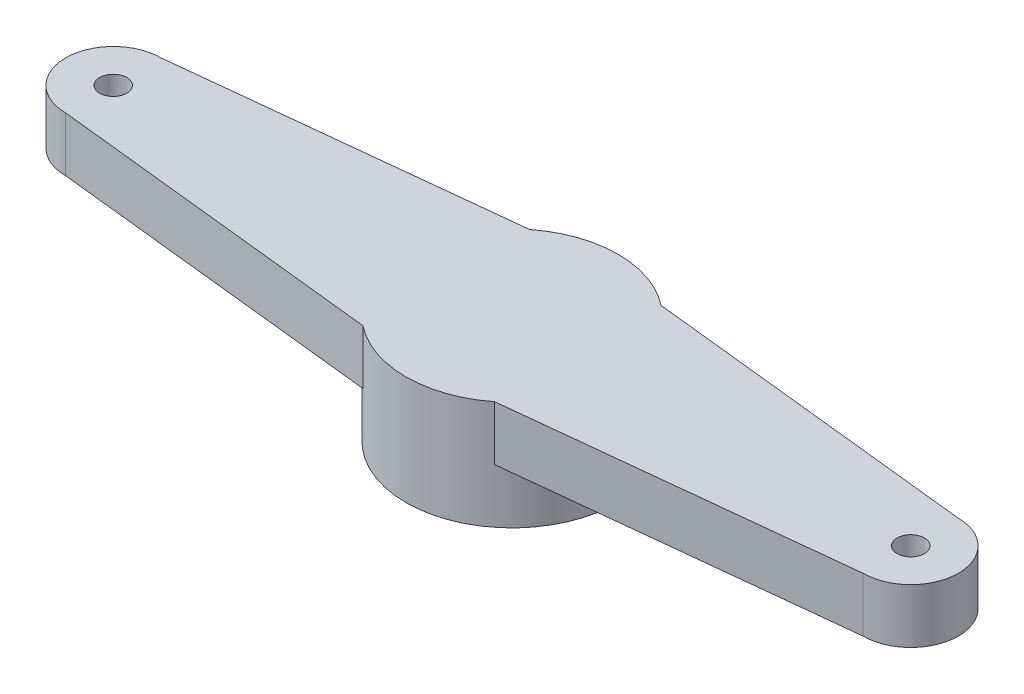
ISO-10303-21;
HEADER;
FILE_DESCRIPTION(('STEP AP214'),'2;1');
FILE_NAME('part.step','',(''),(''),'','','');
FILE_SCHEMA(('AUTOMOTIVE_DESIGN { 1 0 10303 214 1 1 1 1 }'));
ENDSEC;
DATA;
#1=APPLICATION_CONTEXT('core data for automotive mechanical design processes');
#2=APPLICATION_PROTOCOL_DEFINITION('international standard','automotive_design',2000,#1);
#3=PRODUCT_CONTEXT('',#1,'mechanical');
#4=PRODUCT('Part','Part','',(#3));
#5=PRODUCT_RELATED_PRODUCT_CATEGORY('part','',(#4));
#6=PRODUCT_DEFINITION_FORMATION('','',#4);
#7=PRODUCT_DEFINITION_CONTEXT('part definition',#1,'design');
#8=PRODUCT_DEFINITION('design','',#6,#7);
#9=PRODUCT_DEFINITION_SHAPE('','',#8);
#10=(LENGTH_UNIT() NAMED_UNIT(*) SI_UNIT(.MILLI.,.METRE.));
#11=(NAMED_UNIT(*) PLANE_ANGLE_UNIT() SI_UNIT($,.RADIAN.));
#12=(NAMED_UNIT(*) SI_UNIT($,.STERADIAN.) SOLID_ANGLE_UNIT());
#13=UNCERTAINTY_MEASURE_WITH_UNIT(LENGTH_MEASURE(1.E-05),#10,'distance_accuracy_value','');
#14=(GEOMETRIC_REPRESENTATION_CONTEXT(3) GLOBAL_UNCERTAINTY_ASSIGNED_CONTEXT((#13)) GLOBAL_UNIT_ASSIGNED_CONTEXT((#10,
#11,#12)) REPRESENTATION_CONTEXT('',''));
#15=CARTESIAN_POINT('',(0.,0.,0.));
#16=DIRECTION('',(0.,0.,1.));
#17=DIRECTION('',(1.,0.,0.));
#18=AXIS2_PLACEMENT_3D('',#15,#16,#17);
#19=CARTESIAN_POINT('',(-5.70664134658746,-2.,37.4291539918414));
#20=DIRECTION('',(0.,1.,0.));
#21=DIRECTION('',(0.,0.,1.));
#22=AXIS2_PLACEMENT_3D('',#19,#20,#21);
#23=CYLINDRICAL_SURFACE('',#22,3.9);
#24=CARTESIAN_POINT('',(-5.70664134658746,-2.,37.4291539918414));
#25=DIRECTION('',(0.,1.,0.));
#26=DIRECTION('',(0.,0.,1.));
#27=AXIS2_PLACEMENT_3D('',#24,#25,#26);
#28=CIRCLE('',#27,3.9);
#29=CARTESIAN_POINT('',(-5.70664134658746,-2.,41.3291539918414));
#30=VERTEX_POINT('',#29);
#31=EDGE_CURVE('E159',#30,#30,#28,.T.);
#32=ORIENTED_EDGE('',*,*,#31,.T.);
#33=EDGE_LOOP('',(#32));
#34=FACE_BOUND('',#33,.T.);
#35=CARTESIAN_POINT('',(-5.70664134658746,0.,37.4291539918414));
#36=DIRECTION('',(0.,-1.,0.));
#37=DIRECTION('',(0.,0.,-1.));
#38=AXIS2_PLACEMENT_3D('',#35,#36,#37);
#39=CIRCLE('',#38,3.9);
#40=CARTESIAN_POINT('',(-8.12308083620216,0.,34.3679744490784));
#41=VERTEX_POINT('',#40);
#42=CARTESIAN_POINT('',(-8.12308083620216,0.,40.4903335346044));
#43=VERTEX_POINT('',#42);
#44=EDGE_CURVE('E11',#41,#43,#39,.F.);
#45=ORIENTED_EDGE('',*,*,#44,.F.);
#46=DIRECTION('',(0.,1.,0.));
#47=VECTOR('',#46,1.);
#48=CARTESIAN_POINT('',(-8.12308083620216,-2.,34.3679744490784));
#49=LINE('',#48,#47);
#50=CARTESIAN_POINT('',(-8.12308083620216,2.,34.3679744490784));
#51=VERTEX_POINT('',#50);
#52=EDGE_CURVE('E152',#41,#51,#49,.T.);
#53=ORIENTED_EDGE('',*,*,#52,.T.);
#54=CARTESIAN_POINT('',(-5.70664134658746,2.,37.4291539918414));
#55=DIRECTION('',(0.,1.,0.));
#56=DIRECTION('',(0.,0.,1.));
#57=AXIS2_PLACEMENT_3D('',#54,#55,#56);
#58=CIRCLE('',#57,3.9);
#59=CARTESIAN_POINT('',(-3.29020185697275,2.,34.3679744490784));
#60=VERTEX_POINT('',#59);
#61=EDGE_CURVE('E158',#60,#51,#58,.T.);
#62=ORIENTED_EDGE('',*,*,#61,.F.);
#63=DIRECTION('',(0.,1.,0.));
#64=VECTOR('',#63,1.);
#65=CARTESIAN_POINT('',(-3.29020185697275,-2.,34.3679744490784));
#66=LINE('',#65,#64);
#67=CARTESIAN_POINT('',(-3.29020185697275,0.,34.3679744490784));
#68=VERTEX_POINT('',#67);
#69=EDGE_CURVE('E119',#60,#68,#66,.F.);
#70=ORIENTED_EDGE('',*,*,#69,.T.);
#71=CARTESIAN_POINT('',(-3.29020185697275,0.,40.4903335346044));
#72=VERTEX_POINT('',#71);
#73=EDGE_CURVE('E41',#72,#68,#39,.F.);
#74=ORIENTED_EDGE('',*,*,#73,.F.);
#75=DIRECTION('',(0.,1.,0.));
#76=VECTOR('',#75,1.);
#77=CARTESIAN_POINT('',(-3.29020185697275,-2.,40.4903335346044));
#78=LINE('',#77,#76);
#79=CARTESIAN_POINT('',(-3.29020185697275,2.,40.4903335346044));
#80=VERTEX_POINT('',#79);
#81=EDGE_CURVE('E137',#72,#80,#78,.T.);
#82=ORIENTED_EDGE('',*,*,#81,.T.);
#83=CARTESIAN_POINT('',(-8.12308083620216,2.,40.4903335346044));
#84=VERTEX_POINT('',#83);
#85=EDGE_CURVE('E156',#84,#80,#58,.T.);
#86=ORIENTED_EDGE('',*,*,#85,.F.);
#87=DIRECTION('',(0.,1.,0.));
#88=VECTOR('',#87,1.);
#89=CARTESIAN_POINT('',(-8.12308083620216,-2.,40.4903335346044));
#90=LINE('',#89,#88);
#91=EDGE_CURVE('E141',#84,#43,#90,.F.);
#92=ORIENTED_EDGE('',*,*,#91,.T.);
#93=EDGE_LOOP('',(#45,#53,#62,#70,#74,#82,#86,#92));
#94=FACE_BOUND('',#93,.T.);
#95=ADVANCED_FACE('F38',(#34,#94),#23,.T.);
#96=CARTESIAN_POINT('',(-5.70664134658746,-2.,37.4291539918414));
#97=DIRECTION('',(0.,1.,0.));
#98=DIRECTION('',(0.,0.,1.));
#99=AXIS2_PLACEMENT_3D('',#96,#97,#98);
#100=PLANE('',#99);
#101=CARTESIAN_POINT('',(-5.70664134658746,-2.,37.4291539918414));
#102=DIRECTION('',(0.,1.,0.));
#103=DIRECTION('',(0.,0.,1.));
#104=AXIS2_PLACEMENT_3D('',#101,#102,#103);
#105=CIRCLE('',#104,2.25);
#106=CARTESIAN_POINT('',(-5.70664134658746,-2.,39.6791539918414));
#107=VERTEX_POINT('',#106);
#108=EDGE_CURVE('E224',#107,#107,#105,.T.);
#109=ORIENTED_EDGE('',*,*,#108,.T.);
#110=EDGE_LOOP('',(#109));
#111=FACE_BOUND('',#110,.T.);
#112=ORIENTED_EDGE('',*,*,#31,.F.);
#113=EDGE_LOOP('',(#112));
#114=FACE_BOUND('',#113,.T.);
#115=ADVANCED_FACE('F234',(#111,#114),#100,.F.);
#116=CARTESIAN_POINT('',(-5.70664134658746,2.,37.4291539918414));
#117=DIRECTION('',(0.,1.,0.));
#118=DIRECTION('',(0.,0.,1.));
#119=AXIS2_PLACEMENT_3D('',#116,#117,#118);
#120=PLANE('',#119);
#121=ORIENTED_EDGE('',*,*,#85,.T.);
#122=DIRECTION('',(0.994305357259751,0.,-0.106568553169119));
#123=VECTOR('',#122,1.);
#124=CARTESIAN_POINT('',(8.94335865341254,2.,39.1791539918414));
#125=LINE('',#124,#123);
#126=CARTESIAN_POINT('',(8.94335865341254,2.,39.1791539918414));
#127=VERTEX_POINT('',#126);
#128=EDGE_CURVE('E64',#80,#127,#125,.T.);
#129=ORIENTED_EDGE('',*,*,#128,.T.);
#130=CARTESIAN_POINT('',(8.94335865341254,2.,37.4291539918414));
#131=DIRECTION('',(0.,1.,0.));
#132=DIRECTION('',(0.,0.,-1.));
#133=AXIS2_PLACEMENT_3D('',#130,#131,#132);
#134=CIRCLE('',#133,1.75);
#135=CARTESIAN_POINT('',(8.94335865341254,2.,35.6791539918414));
#136=VERTEX_POINT('',#135);
#137=EDGE_CURVE('E124',#127,#136,#134,.T.);
#138=ORIENTED_EDGE('',*,*,#137,.T.);
#139=DIRECTION('',(-0.994305357259751,0.,-0.106568553169119));
#140=VECTOR('',#139,1.);
#141=CARTESIAN_POINT('',(8.94335865341254,2.,35.6791539918414));
#142=LINE('',#141,#140);
#143=EDGE_CURVE('E111',#136,#60,#142,.T.);
#144=ORIENTED_EDGE('',*,*,#143,.T.);
#145=ORIENTED_EDGE('',*,*,#61,.T.);
#146=DIRECTION('',(-0.994305357259751,0.,0.106568553169119));
#147=VECTOR('',#146,1.);
#148=CARTESIAN_POINT('',(-20.3566413465875,2.,35.6791539918414));
#149=LINE('',#148,#147);
#150=CARTESIAN_POINT('',(-20.3566413465875,2.,35.6791539918414));
#151=VERTEX_POINT('',#150);
#152=EDGE_CURVE('E123',#51,#151,#149,.T.);
#153=ORIENTED_EDGE('',*,*,#152,.T.);
#154=CARTESIAN_POINT('',(-20.3566413465875,2.,37.4291539918414));
#155=DIRECTION('',(0.,1.,0.));
#156=DIRECTION('',(0.,0.,1.));
#157=AXIS2_PLACEMENT_3D('',#154,#155,#156);
#158=CIRCLE('',#157,1.75);
#159=CARTESIAN_POINT('',(-20.3566413465875,2.,39.1791539918414));
#160=VERTEX_POINT('',#159);
#161=EDGE_CURVE('E202',#151,#160,#158,.T.);
#162=ORIENTED_EDGE('',*,*,#161,.T.);
#163=DIRECTION('',(0.994305357259751,0.,0.106568553169119));
#164=VECTOR('',#163,1.);
#165=CARTESIAN_POINT('',(-20.3566413465875,2.,39.1791539918414));
#166=LINE('',#165,#164);
#167=EDGE_CURVE('E198',#160,#84,#166,.T.);
#168=ORIENTED_EDGE('',*,*,#167,.T.);
#169=EDGE_LOOP('',(#121,#129,#138,#144,#145,#153,#162,#168));
#170=FACE_BOUND('',#169,.T.);
#171=CARTESIAN_POINT('',(8.94335865341254,2.,37.4291539918414));
#172=DIRECTION('',(0.,1.,0.));
#173=DIRECTION('',(0.,0.,-1.));
#174=AXIS2_PLACEMENT_3D('',#171,#172,#173);
#175=CIRCLE('',#174,0.500000000000001);
#176=CARTESIAN_POINT('',(8.94335865341254,2.,36.9291539918414));
#177=VERTEX_POINT('',#176);
#178=EDGE_CURVE('E210',#177,#177,#175,.T.);
#179=ORIENTED_EDGE('',*,*,#178,.F.);
#180=EDGE_LOOP('',(#179));
#181=FACE_BOUND('',#180,.T.);
#182=CARTESIAN_POINT('',(-20.3566413465875,2.,37.4291539918414));
#183=DIRECTION('',(0.,1.,0.));
#184=DIRECTION('',(0.,0.,1.));
#185=AXIS2_PLACEMENT_3D('',#182,#183,#184);
#186=CIRCLE('',#185,0.499999999999999);
#187=CARTESIAN_POINT('',(-20.3566413465875,2.,37.9291539918414));
#188=VERTEX_POINT('',#187);
#189=EDGE_CURVE('E217',#188,#188,#186,.T.);
#190=ORIENTED_EDGE('',*,*,#189,.F.);
#191=EDGE_LOOP('',(#190));
#192=FACE_BOUND('',#191,.T.);
#193=ADVANCED_FACE('F128',(#170,#181,#192),#120,.T.);
#194=CARTESIAN_POINT('',(8.94335865341254,2.,37.4291539918414));
#195=DIRECTION('',(0.,-1.,0.));
#196=DIRECTION('',(0.,0.,-1.));
#197=AXIS2_PLACEMENT_3D('',#194,#195,#196);
#198=CYLINDRICAL_SURFACE('',#197,0.500000000000001);
#199=ORIENTED_EDGE('',*,*,#178,.T.);
#200=EDGE_LOOP('',(#199));
#201=FACE_BOUND('',#200,.T.);
#202=CARTESIAN_POINT('',(8.94335865341254,0.,37.4291539918414));
#203=DIRECTION('',(0.,1.,0.));
#204=DIRECTION('',(0.,0.,-1.));
#205=AXIS2_PLACEMENT_3D('',#202,#203,#204);
#206=CIRCLE('',#205,0.500000000000001);
#207=CARTESIAN_POINT('',(8.94335865341254,0.,36.9291539918414));
#208=VERTEX_POINT('',#207);
#209=EDGE_CURVE('E212',#208,#208,#206,.T.);
#210=ORIENTED_EDGE('',*,*,#209,.F.);
#211=EDGE_LOOP('',(#210));
#212=FACE_BOUND('',#211,.T.);
#213=ADVANCED_FACE('F256',(#201,#212),#198,.F.);
#214=CARTESIAN_POINT('',(8.94335865341254,2.,37.4291539918414));
#215=DIRECTION('',(0.,-1.,0.));
#216=DIRECTION('',(0.,0.,-1.));
#217=AXIS2_PLACEMENT_3D('',#214,#215,#216);
#218=CYLINDRICAL_SURFACE('',#217,1.75);
#219=CARTESIAN_POINT('',(8.94335865341254,0.,37.4291539918414));
#220=DIRECTION('',(0.,1.,0.));
#221=DIRECTION('',(0.,0.,-1.));
#222=AXIS2_PLACEMENT_3D('',#219,#220,#221);
#223=CIRCLE('',#222,1.75);
#224=CARTESIAN_POINT('',(8.94335865341254,0.,39.1791539918414));
#225=VERTEX_POINT('',#224);
#226=CARTESIAN_POINT('',(8.94335865341254,0.,35.6791539918414));
#227=VERTEX_POINT('',#226);
#228=EDGE_CURVE('E136',#225,#227,#223,.T.);
#229=ORIENTED_EDGE('',*,*,#228,.T.);
#230=DIRECTION('',(0.,-1.,0.));
#231=VECTOR('',#230,1.);
#232=CARTESIAN_POINT('',(8.94335865341254,2.,35.6791539918414));
#233=LINE('',#232,#231);
#234=EDGE_CURVE('E116',#136,#227,#233,.T.);
#235=ORIENTED_EDGE('',*,*,#234,.F.);
#236=ORIENTED_EDGE('',*,*,#137,.F.);
#237=DIRECTION('',(0.,-1.,0.));
#238=VECTOR('',#237,1.);
#239=CARTESIAN_POINT('',(8.94335865341254,2.,39.1791539918414));
#240=LINE('',#239,#238);
#241=EDGE_CURVE('E191',#127,#225,#240,.T.);
#242=ORIENTED_EDGE('',*,*,#241,.T.);
#243=EDGE_LOOP('',(#229,#235,#236,#242));
#244=FACE_BOUND('',#243,.T.);
#245=ADVANCED_FACE('F134',(#244),#218,.T.);
#246=CARTESIAN_POINT('',(8.94335865341254,2.,35.6791539918414));
#247=DIRECTION('',(-0.106568553169119,0.,0.994305357259751));
#248=DIRECTION('',(0.994305357259751,0.,0.106568553169119));
#249=AXIS2_PLACEMENT_3D('',#246,#247,#248);
#250=PLANE('',#249);
#251=ORIENTED_EDGE('',*,*,#69,.F.);
#252=ORIENTED_EDGE('',*,*,#143,.F.);
#253=ORIENTED_EDGE('',*,*,#234,.T.);
#254=DIRECTION('',(-0.994305357259751,0.,-0.106568553169119));
#255=VECTOR('',#254,1.);
#256=CARTESIAN_POINT('',(8.94335865341254,0.,35.6791539918414));
#257=LINE('',#256,#255);
#258=EDGE_CURVE('E179',#227,#68,#257,.T.);
#259=ORIENTED_EDGE('',*,*,#258,.T.);
#260=EDGE_LOOP('',(#251,#252,#253,#259));
#261=FACE_BOUND('',#260,.T.);
#262=ADVANCED_FACE('F113',(#261),#250,.F.);
#263=CARTESIAN_POINT('',(8.94335865341254,2.,39.1791539918414));
#264=DIRECTION('',(-0.106568553169119,0.,-0.994305357259751));
#265=DIRECTION('',(-0.994305357259751,0.,0.106568553169119));
#266=AXIS2_PLACEMENT_3D('',#263,#264,#265);
#267=PLANE('',#266);
#268=ORIENTED_EDGE('',*,*,#81,.F.);
#269=DIRECTION('',(0.994305357259751,0.,-0.106568553169119));
#270=VECTOR('',#269,1.);
#271=CARTESIAN_POINT('',(8.94335865341254,0.,39.1791539918414));
#272=LINE('',#271,#270);
#273=EDGE_CURVE('E132',#72,#225,#272,.T.);
#274=ORIENTED_EDGE('',*,*,#273,.T.);
#275=ORIENTED_EDGE('',*,*,#241,.F.);
#276=ORIENTED_EDGE('',*,*,#128,.F.);
#277=EDGE_LOOP('',(#268,#274,#275,#276));
#278=FACE_BOUND('',#277,.T.);
#279=ADVANCED_FACE('F263',(#278),#267,.F.);
#280=CARTESIAN_POINT('',(8.94335865341254,0.,37.4291539918414));
#281=DIRECTION('',(0.,-1.,0.));
#282=DIRECTION('',(0.,0.,-1.));
#283=AXIS2_PLACEMENT_3D('',#280,#281,#282);
#284=PLANE('',#283);
#285=ORIENTED_EDGE('',*,*,#209,.T.);
#286=EDGE_LOOP('',(#285));
#287=FACE_BOUND('',#286,.T.);
#288=ORIENTED_EDGE('',*,*,#273,.F.);
#289=ORIENTED_EDGE('',*,*,#73,.T.);
#290=ORIENTED_EDGE('',*,*,#258,.F.);
#291=ORIENTED_EDGE('',*,*,#228,.F.);
#292=EDGE_LOOP('',(#288,#289,#290,#291));
#293=FACE_BOUND('',#292,.T.);
#294=ADVANCED_FACE('F272',(#287,#293),#284,.T.);
#295=CARTESIAN_POINT('',(-20.3566413465875,0.,37.4291539918414));
#296=DIRECTION('',(0.,1.,0.));
#297=DIRECTION('',(0.,0.,1.));
#298=AXIS2_PLACEMENT_3D('',#295,#296,#297);
#299=CIRCLE('',#298,0.499999999999999);
#300=CARTESIAN_POINT('',(-20.3566413465875,0.,37.9291539918414));
#301=VERTEX_POINT('',#300);
#302=EDGE_CURVE('E220',#301,#301,#299,.T.);
#303=ORIENTED_EDGE('',*,*,#302,.T.);
#304=EDGE_LOOP('',(#303));
#305=FACE_BOUND('',#304,.T.);
#306=DIRECTION('',(-0.994305357259751,0.,0.106568553169119));
#307=VECTOR('',#306,1.);
#308=CARTESIAN_POINT('',(-20.3566413465875,0.,35.6791539918414));
#309=LINE('',#308,#307);
#310=CARTESIAN_POINT('',(-20.3566413465875,0.,35.6791539918414));
#311=VERTEX_POINT('',#310);
#312=EDGE_CURVE('E173',#41,#311,#309,.T.);
#313=ORIENTED_EDGE('',*,*,#312,.F.);
#314=ORIENTED_EDGE('',*,*,#44,.T.);
#315=DIRECTION('',(0.994305357259751,0.,0.106568553169119));
#316=VECTOR('',#315,1.);
#317=CARTESIAN_POINT('',(-20.3566413465875,0.,39.1791539918414));
#318=LINE('',#317,#316);
#319=CARTESIAN_POINT('',(-20.3566413465875,0.,39.1791539918414));
#320=VERTEX_POINT('',#319);
#321=EDGE_CURVE('E56',#320,#43,#318,.T.);
#322=ORIENTED_EDGE('',*,*,#321,.F.);
#323=CARTESIAN_POINT('',(-20.3566413465875,0.,37.4291539918414));
#324=DIRECTION('',(0.,1.,0.));
#325=DIRECTION('',(0.,0.,1.));
#326=AXIS2_PLACEMENT_3D('',#323,#324,#325);
#327=CIRCLE('',#326,1.75);
#328=EDGE_CURVE('E177',#311,#320,#327,.T.);
#329=ORIENTED_EDGE('',*,*,#328,.F.);
#330=EDGE_LOOP('',(#313,#314,#322,#329));
#331=FACE_BOUND('',#330,.T.);
#332=ADVANCED_FACE('F176',(#305,#331),#284,.T.);
#333=CARTESIAN_POINT('',(-20.3566413465875,2.,35.6791539918414));
#334=DIRECTION('',(0.106568553169119,0.,0.994305357259751));
#335=DIRECTION('',(0.994305357259751,0.,-0.106568553169119));
#336=AXIS2_PLACEMENT_3D('',#333,#334,#335);
#337=PLANE('',#336);
#338=ORIENTED_EDGE('',*,*,#52,.F.);
#339=ORIENTED_EDGE('',*,*,#312,.T.);
#340=DIRECTION('',(0.,-1.,0.));
#341=VECTOR('',#340,1.);
#342=CARTESIAN_POINT('',(-20.3566413465875,2.,35.6791539918414));
#343=LINE('',#342,#341);
#344=EDGE_CURVE('E138',#151,#311,#343,.T.);
#345=ORIENTED_EDGE('',*,*,#344,.F.);
#346=ORIENTED_EDGE('',*,*,#152,.F.);
#347=EDGE_LOOP('',(#338,#339,#345,#346));
#348=FACE_BOUND('',#347,.T.);
#349=ADVANCED_FACE('F172',(#348),#337,.F.);
#350=CARTESIAN_POINT('',(-20.3566413465875,2.,37.4291539918414));
#351=DIRECTION('',(0.,-1.,0.));
#352=DIRECTION('',(0.,0.,-1.));
#353=AXIS2_PLACEMENT_3D('',#350,#351,#352);
#354=CYLINDRICAL_SURFACE('',#353,1.75);
#355=ORIENTED_EDGE('',*,*,#328,.T.);
#356=DIRECTION('',(0.,-1.,0.));
#357=VECTOR('',#356,1.);
#358=CARTESIAN_POINT('',(-20.3566413465875,2.,39.1791539918414));
#359=LINE('',#358,#357);
#360=EDGE_CURVE('E145',#160,#320,#359,.T.);
#361=ORIENTED_EDGE('',*,*,#360,.F.);
#362=ORIENTED_EDGE('',*,*,#161,.F.);
#363=ORIENTED_EDGE('',*,*,#344,.T.);
#364=EDGE_LOOP('',(#355,#361,#362,#363));
#365=FACE_BOUND('',#364,.T.);
#366=ADVANCED_FACE('F201',(#365),#354,.T.);
#367=CARTESIAN_POINT('',(-20.3566413465875,2.,39.1791539918414));
#368=DIRECTION('',(0.106568553169119,0.,-0.994305357259751));
#369=DIRECTION('',(-0.994305357259751,0.,-0.106568553169119));
#370=AXIS2_PLACEMENT_3D('',#367,#368,#369);
#371=PLANE('',#370);
#372=ORIENTED_EDGE('',*,*,#91,.F.);
#373=ORIENTED_EDGE('',*,*,#167,.F.);
#374=ORIENTED_EDGE('',*,*,#360,.T.);
#375=ORIENTED_EDGE('',*,*,#321,.T.);
#376=EDGE_LOOP('',(#372,#373,#374,#375));
#377=FACE_BOUND('',#376,.T.);
#378=ADVANCED_FACE('F196',(#377),#371,.F.);
#379=CARTESIAN_POINT('',(-20.3566413465875,2.,37.4291539918414));
#380=DIRECTION('',(0.,-1.,0.));
#381=DIRECTION('',(0.,0.,-1.));
#382=AXIS2_PLACEMENT_3D('',#379,#380,#381);
#383=CYLINDRICAL_SURFACE('',#382,0.499999999999999);
#384=ORIENTED_EDGE('',*,*,#189,.T.);
#385=EDGE_LOOP('',(#384));
#386=FACE_BOUND('',#385,.T.);
#387=ORIENTED_EDGE('',*,*,#302,.F.);
#388=EDGE_LOOP('',(#387));
#389=FACE_BOUND('',#388,.T.);
#390=ADVANCED_FACE('F241',(#386,#389),#383,.F.);
#391=CARTESIAN_POINT('',(-5.70664134658746,-2.,37.4291539918414));
#392=DIRECTION('',(0.,1.,0.));
#393=DIRECTION('',(0.,0.,1.));
#394=AXIS2_PLACEMENT_3D('',#391,#392,#393);
#395=CYLINDRICAL_SURFACE('',#394,2.25);
#396=ORIENTED_EDGE('',*,*,#108,.F.);
#397=EDGE_LOOP('',(#396));
#398=FACE_BOUND('',#397,.T.);
#399=CARTESIAN_POINT('',(-5.70664134658746,0.,37.4291539918414));
#400=DIRECTION('',(0.,1.,0.));
#401=DIRECTION('',(0.,0.,1.));
#402=AXIS2_PLACEMENT_3D('',#399,#400,#401);
#403=CIRCLE('',#402,2.25);
#404=CARTESIAN_POINT('',(-5.70664134658746,0.,39.6791539918414));
#405=VERTEX_POINT('',#404);
#406=EDGE_CURVE('E227',#405,#405,#403,.T.);
#407=ORIENTED_EDGE('',*,*,#406,.T.);
#408=EDGE_LOOP('',(#407));
#409=FACE_BOUND('',#408,.T.);
#410=ADVANCED_FACE('F237',(#398,#409),#395,.F.);
#411=CARTESIAN_POINT('',(-5.70664134658746,0.,37.4291539918414));
#412=DIRECTION('',(0.,1.,0.));
#413=DIRECTION('',(0.,0.,1.));
#414=AXIS2_PLACEMENT_3D('',#411,#412,#413);
#415=PLANE('',#414);
#416=ORIENTED_EDGE('',*,*,#406,.F.);
#417=EDGE_LOOP('',(#416));
#418=FACE_BOUND('',#417,.T.);
#419=ADVANCED_FACE('F240',(#418),#415,.F.);
#420=CLOSED_SHELL('',(#95,#115,#193,#213,#245,#262,#279,#294,#332,#349,#366,#378,#390,#410,#419));
#421=MANIFOLD_SOLID_BREP('B2',#420);
#422=ADVANCED_BREP_SHAPE_REPRESENTATION('',(#18,#421),#14);
#423=SHAPE_DEFINITION_REPRESENTATION(#9,#422);
ENDSEC;
END-ISO-10303-21;
